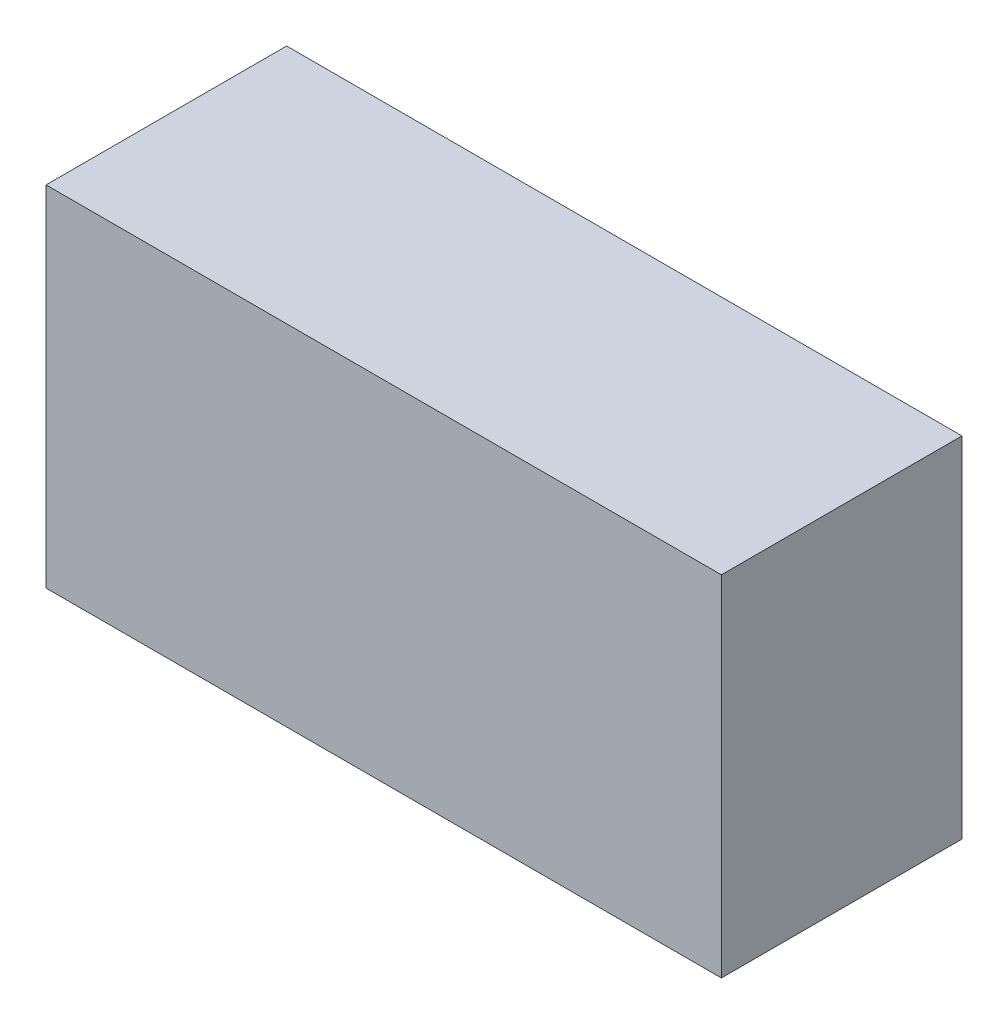
ISO-10303-21;
HEADER;
FILE_DESCRIPTION(('STEP AP214'),'2;1');
FILE_NAME('part.step','',(''),(''),'','','');
FILE_SCHEMA(('AUTOMOTIVE_DESIGN { 1 0 10303 214 1 1 1 1 }'));
ENDSEC;
DATA;
#1=APPLICATION_CONTEXT('core data for automotive mechanical design processes');
#2=APPLICATION_PROTOCOL_DEFINITION('international standard','automotive_design',2000,#1);
#3=PRODUCT_CONTEXT('',#1,'mechanical');
#4=PRODUCT('Part','Part','',(#3));
#5=PRODUCT_RELATED_PRODUCT_CATEGORY('part','',(#4));
#6=PRODUCT_DEFINITION_FORMATION('','',#4);
#7=PRODUCT_DEFINITION_CONTEXT('part definition',#1,'design');
#8=PRODUCT_DEFINITION('design','',#6,#7);
#9=PRODUCT_DEFINITION_SHAPE('','',#8);
#10=(LENGTH_UNIT() NAMED_UNIT(*) SI_UNIT(.MILLI.,.METRE.));
#11=(NAMED_UNIT(*) PLANE_ANGLE_UNIT() SI_UNIT($,.RADIAN.));
#12=(NAMED_UNIT(*) SI_UNIT($,.STERADIAN.) SOLID_ANGLE_UNIT());
#13=UNCERTAINTY_MEASURE_WITH_UNIT(LENGTH_MEASURE(1.E-05),#10,'distance_accuracy_value','');
#14=(GEOMETRIC_REPRESENTATION_CONTEXT(3) GLOBAL_UNCERTAINTY_ASSIGNED_CONTEXT((#13)) GLOBAL_UNIT_ASSIGNED_CONTEXT((#10,
#11,#12)) REPRESENTATION_CONTEXT('',''));
#15=CARTESIAN_POINT('',(0.,0.,0.));
#16=DIRECTION('',(0.,0.,1.));
#17=DIRECTION('',(1.,0.,0.));
#18=AXIS2_PLACEMENT_3D('',#15,#16,#17);
#19=CARTESIAN_POINT('',(9.825,10.16,-3.5));
#20=DIRECTION('',(-1.,0.,0.));
#21=DIRECTION('',(0.,0.,1.));
#22=AXIS2_PLACEMENT_3D('',#19,#20,#21);
#23=PLANE('',#22);
#24=DIRECTION('',(0.,0.,-1.));
#25=VECTOR('',#24,1.);
#26=CARTESIAN_POINT('',(9.825,0.,-3.5));
#27=LINE('',#26,#25);
#28=CARTESIAN_POINT('',(9.825,0.,3.5));
#29=VERTEX_POINT('',#28);
#30=CARTESIAN_POINT('',(9.825,0.,-3.5));
#31=VERTEX_POINT('',#30);
#32=EDGE_CURVE('E104',#29,#31,#27,.T.);
#33=ORIENTED_EDGE('',*,*,#32,.T.);
#34=DIRECTION('',(0.,-1.,0.));
#35=VECTOR('',#34,1.);
#36=CARTESIAN_POINT('',(9.825,10.16,-3.5));
#37=LINE('',#36,#35);
#38=CARTESIAN_POINT('',(9.825,10.16,-3.5));
#39=VERTEX_POINT('',#38);
#40=EDGE_CURVE('E95',#39,#31,#37,.T.);
#41=ORIENTED_EDGE('',*,*,#40,.F.);
#42=DIRECTION('',(0.,0.,-1.));
#43=VECTOR('',#42,1.);
#44=CARTESIAN_POINT('',(9.825,10.16,-3.5));
#45=LINE('',#44,#43);
#46=CARTESIAN_POINT('',(9.825,10.16,3.5));
#47=VERTEX_POINT('',#46);
#48=EDGE_CURVE('E89',#47,#39,#45,.T.);
#49=ORIENTED_EDGE('',*,*,#48,.F.);
#50=DIRECTION('',(0.,-1.,0.));
#51=VECTOR('',#50,1.);
#52=CARTESIAN_POINT('',(9.825,10.16,3.5));
#53=LINE('',#52,#51);
#54=EDGE_CURVE('E100',#47,#29,#53,.T.);
#55=ORIENTED_EDGE('',*,*,#54,.T.);
#56=EDGE_LOOP('',(#33,#41,#49,#55));
#57=FACE_BOUND('',#56,.T.);
#58=ADVANCED_FACE('F37',(#57),#23,.F.);
#59=CARTESIAN_POINT('',(-9.825,10.16,-3.5));
#60=DIRECTION('',(0.,0.,1.));
#61=DIRECTION('',(1.,0.,0.));
#62=AXIS2_PLACEMENT_3D('',#59,#60,#61);
#63=PLANE('',#62);
#64=DIRECTION('',(-1.,0.,0.));
#65=VECTOR('',#64,1.);
#66=CARTESIAN_POINT('',(-9.825,0.,-3.5));
#67=LINE('',#66,#65);
#68=CARTESIAN_POINT('',(-9.825,0.,-3.5));
#69=VERTEX_POINT('',#68);
#70=EDGE_CURVE('E94',#31,#69,#67,.T.);
#71=ORIENTED_EDGE('',*,*,#70,.T.);
#72=DIRECTION('',(0.,-1.,0.));
#73=VECTOR('',#72,1.);
#74=CARTESIAN_POINT('',(-9.825,10.16,-3.5));
#75=LINE('',#74,#73);
#76=CARTESIAN_POINT('',(-9.825,10.16,-3.5));
#77=VERTEX_POINT('',#76);
#78=EDGE_CURVE('E92',#77,#69,#75,.T.);
#79=ORIENTED_EDGE('',*,*,#78,.F.);
#80=DIRECTION('',(-1.,0.,0.));
#81=VECTOR('',#80,1.);
#82=CARTESIAN_POINT('',(-9.825,10.16,-3.5));
#83=LINE('',#82,#81);
#84=EDGE_CURVE('E84',#39,#77,#83,.T.);
#85=ORIENTED_EDGE('',*,*,#84,.F.);
#86=ORIENTED_EDGE('',*,*,#40,.T.);
#87=EDGE_LOOP('',(#71,#79,#85,#86));
#88=FACE_BOUND('',#87,.T.);
#89=ADVANCED_FACE('F93',(#88),#63,.F.);
#90=CARTESIAN_POINT('',(-9.825,10.16,-3.5));
#91=DIRECTION('',(1.,0.,0.));
#92=DIRECTION('',(0.,0.,-1.));
#93=AXIS2_PLACEMENT_3D('',#90,#91,#92);
#94=PLANE('',#93);
#95=DIRECTION('',(0.,0.,1.));
#96=VECTOR('',#95,1.);
#97=CARTESIAN_POINT('',(-9.825,0.,-3.5));
#98=LINE('',#97,#96);
#99=CARTESIAN_POINT('',(-9.825,0.,3.5));
#100=VERTEX_POINT('',#99);
#101=EDGE_CURVE('E70',#69,#100,#98,.T.);
#102=ORIENTED_EDGE('',*,*,#101,.T.);
#103=DIRECTION('',(0.,-1.,0.));
#104=VECTOR('',#103,1.);
#105=CARTESIAN_POINT('',(-9.825,10.16,3.5));
#106=LINE('',#105,#104);
#107=CARTESIAN_POINT('',(-9.825,10.16,3.5));
#108=VERTEX_POINT('',#107);
#109=EDGE_CURVE('E96',#108,#100,#106,.T.);
#110=ORIENTED_EDGE('',*,*,#109,.F.);
#111=DIRECTION('',(0.,0.,1.));
#112=VECTOR('',#111,1.);
#113=CARTESIAN_POINT('',(-9.825,10.16,-3.5));
#114=LINE('',#113,#112);
#115=EDGE_CURVE('E87',#77,#108,#114,.T.);
#116=ORIENTED_EDGE('',*,*,#115,.F.);
#117=ORIENTED_EDGE('',*,*,#78,.T.);
#118=EDGE_LOOP('',(#102,#110,#116,#117));
#119=FACE_BOUND('',#118,.T.);
#120=ADVANCED_FACE('F98',(#119),#94,.F.);
#121=CARTESIAN_POINT('',(-9.825,10.16,3.5));
#122=DIRECTION('',(0.,0.,-1.));
#123=DIRECTION('',(-1.,0.,0.));
#124=AXIS2_PLACEMENT_3D('',#121,#122,#123);
#125=PLANE('',#124);
#126=DIRECTION('',(1.,0.,0.));
#127=VECTOR('',#126,1.);
#128=CARTESIAN_POINT('',(-9.825,0.,3.5));
#129=LINE('',#128,#127);
#130=EDGE_CURVE('E76',#100,#29,#129,.T.);
#131=ORIENTED_EDGE('',*,*,#130,.T.);
#132=ORIENTED_EDGE('',*,*,#54,.F.);
#133=DIRECTION('',(1.,0.,0.));
#134=VECTOR('',#133,1.);
#135=CARTESIAN_POINT('',(-9.825,10.16,3.5));
#136=LINE('',#135,#134);
#137=EDGE_CURVE('E53',#108,#47,#136,.T.);
#138=ORIENTED_EDGE('',*,*,#137,.F.);
#139=ORIENTED_EDGE('',*,*,#109,.T.);
#140=EDGE_LOOP('',(#131,#132,#138,#139));
#141=FACE_BOUND('',#140,.T.);
#142=ADVANCED_FACE('F141',(#141),#125,.F.);
#143=CARTESIAN_POINT('',(0.,10.16,0.));
#144=DIRECTION('',(0.,1.,0.));
#145=DIRECTION('',(0.,0.,1.));
#146=AXIS2_PLACEMENT_3D('',#143,#144,#145);
#147=PLANE('',#146);
#148=ORIENTED_EDGE('',*,*,#48,.T.);
#149=ORIENTED_EDGE('',*,*,#84,.T.);
#150=ORIENTED_EDGE('',*,*,#115,.T.);
#151=ORIENTED_EDGE('',*,*,#137,.T.);
#152=EDGE_LOOP('',(#148,#149,#150,#151));
#153=FACE_BOUND('',#152,.T.);
#154=ADVANCED_FACE('F85',(#153),#147,.T.);
#155=CARTESIAN_POINT('',(0.,0.,0.));
#156=DIRECTION('',(0.,1.,0.));
#157=DIRECTION('',(0.,0.,1.));
#158=AXIS2_PLACEMENT_3D('',#155,#156,#157);
#159=PLANE('',#158);
#160=CARTESIAN_POINT('',(-7.615,0.,-2.8));
#161=DIRECTION('',(0.,1.,0.));
#162=DIRECTION('',(0.,0.,1.));
#163=AXIS2_PLACEMENT_3D('',#160,#161,#162);
#164=CIRCLE('',#163,0.249999999999999);
#165=CARTESIAN_POINT('',(-7.615,0.,-2.55));
#166=VERTEX_POINT('',#165);
#167=EDGE_CURVE('E11',#166,#166,#164,.F.);
#168=ORIENTED_EDGE('',*,*,#167,.F.);
#169=EDGE_LOOP('',(#168));
#170=FACE_BOUND('',#169,.T.);
#171=CARTESIAN_POINT('',(-5.075,0.,-2.8));
#172=DIRECTION('',(0.,1.,0.));
#173=DIRECTION('',(0.,0.,1.));
#174=AXIS2_PLACEMENT_3D('',#171,#172,#173);
#175=CIRCLE('',#174,0.25);
#176=CARTESIAN_POINT('',(-5.075,0.,-2.55));
#177=VERTEX_POINT('',#176);
#178=EDGE_CURVE('E45',#177,#177,#175,.F.);
#179=ORIENTED_EDGE('',*,*,#178,.F.);
#180=EDGE_LOOP('',(#179));
#181=FACE_BOUND('',#180,.T.);
#182=CARTESIAN_POINT('',(5.085,0.,-2.8));
#183=DIRECTION('',(0.,1.,0.));
#184=DIRECTION('',(0.,0.,1.));
#185=AXIS2_PLACEMENT_3D('',#182,#183,#184);
#186=CIRCLE('',#185,0.25);
#187=CARTESIAN_POINT('',(5.085,0.,-2.55));
#188=VERTEX_POINT('',#187);
#189=EDGE_CURVE('E120',#188,#188,#186,.F.);
#190=ORIENTED_EDGE('',*,*,#189,.F.);
#191=EDGE_LOOP('',(#190));
#192=FACE_BOUND('',#191,.T.);
#193=CARTESIAN_POINT('',(2.545,0.,-2.8));
#194=DIRECTION('',(0.,1.,0.));
#195=DIRECTION('',(0.,0.,1.));
#196=AXIS2_PLACEMENT_3D('',#193,#194,#195);
#197=CIRCLE('',#196,0.250000000000001);
#198=CARTESIAN_POINT('',(2.545,0.,-2.55));
#199=VERTEX_POINT('',#198);
#200=EDGE_CURVE('E117',#199,#199,#197,.F.);
#201=ORIENTED_EDGE('',*,*,#200,.F.);
#202=EDGE_LOOP('',(#201));
#203=FACE_BOUND('',#202,.T.);
#204=CARTESIAN_POINT('',(0.005,0.,-2.8));
#205=DIRECTION('',(0.,1.,0.));
#206=DIRECTION('',(0.,0.,1.));
#207=AXIS2_PLACEMENT_3D('',#204,#205,#206);
#208=CIRCLE('',#207,0.25);
#209=CARTESIAN_POINT('',(0.005,0.,-2.55));
#210=VERTEX_POINT('',#209);
#211=EDGE_CURVE('E114',#210,#210,#208,.F.);
#212=ORIENTED_EDGE('',*,*,#211,.F.);
#213=EDGE_LOOP('',(#212));
#214=FACE_BOUND('',#213,.T.);
#215=ORIENTED_EDGE('',*,*,#32,.F.);
#216=ORIENTED_EDGE('',*,*,#130,.F.);
#217=ORIENTED_EDGE('',*,*,#101,.F.);
#218=ORIENTED_EDGE('',*,*,#70,.F.);
#219=EDGE_LOOP('',(#215,#216,#217,#218));
#220=FACE_BOUND('',#219,.T.);
#221=ADVANCED_FACE('F127',(#170,#181,#192,#203,#214,#220),#159,.F.);
#222=CARTESIAN_POINT('',(0.005,-4.1,-2.8));
#223=DIRECTION('',(0.,1.,0.));
#224=DIRECTION('',(0.,0.,1.));
#225=AXIS2_PLACEMENT_3D('',#222,#223,#224);
#226=CYLINDRICAL_SURFACE('',#225,0.25);
#227=CARTESIAN_POINT('',(0.005,-4.1,-2.8));
#228=DIRECTION('',(0.,-1.,0.));
#229=DIRECTION('',(0.,0.,-1.));
#230=AXIS2_PLACEMENT_3D('',#227,#228,#229);
#231=CIRCLE('',#230,0.25);
#232=CARTESIAN_POINT('',(0.005,-4.1,-3.05));
#233=VERTEX_POINT('',#232);
#234=EDGE_CURVE('E107',#233,#233,#231,.T.);
#235=ORIENTED_EDGE('',*,*,#234,.F.);
#236=EDGE_LOOP('',(#235));
#237=FACE_BOUND('',#236,.T.);
#238=ORIENTED_EDGE('',*,*,#211,.T.);
#239=EDGE_LOOP('',(#238));
#240=FACE_BOUND('',#239,.T.);
#241=ADVANCED_FACE('F130',(#237,#240),#226,.T.);
#242=CARTESIAN_POINT('',(0.005,-4.1,-2.8));
#243=DIRECTION('',(0.,-1.,0.));
#244=DIRECTION('',(0.,0.,-1.));
#245=AXIS2_PLACEMENT_3D('',#242,#243,#244);
#246=PLANE('',#245);
#247=ORIENTED_EDGE('',*,*,#234,.T.);
#248=EDGE_LOOP('',(#247));
#249=FACE_BOUND('',#248,.T.);
#250=ADVANCED_FACE('F189',(#249),#246,.T.);
#251=CARTESIAN_POINT('',(2.545,-4.1,-2.8));
#252=DIRECTION('',(0.,1.,0.));
#253=DIRECTION('',(0.,0.,1.));
#254=AXIS2_PLACEMENT_3D('',#251,#252,#253);
#255=CYLINDRICAL_SURFACE('',#254,0.250000000000001);
#256=CARTESIAN_POINT('',(2.545,-4.1,-2.8));
#257=DIRECTION('',(0.,-1.,0.));
#258=DIRECTION('',(0.,0.,-1.));
#259=AXIS2_PLACEMENT_3D('',#256,#257,#258);
#260=CIRCLE('',#259,0.250000000000001);
#261=CARTESIAN_POINT('',(2.545,-4.1,-3.05));
#262=VERTEX_POINT('',#261);
#263=EDGE_CURVE('E327',#262,#262,#260,.T.);
#264=ORIENTED_EDGE('',*,*,#263,.F.);
#265=EDGE_LOOP('',(#264));
#266=FACE_BOUND('',#265,.T.);
#267=ORIENTED_EDGE('',*,*,#200,.T.);
#268=EDGE_LOOP('',(#267));
#269=FACE_BOUND('',#268,.T.);
#270=ADVANCED_FACE('F200',(#266,#269),#255,.T.);
#271=CARTESIAN_POINT('',(2.545,-4.1,-2.8));
#272=DIRECTION('',(0.,-1.,0.));
#273=DIRECTION('',(0.,0.,-1.));
#274=AXIS2_PLACEMENT_3D('',#271,#272,#273);
#275=PLANE('',#274);
#276=ORIENTED_EDGE('',*,*,#263,.T.);
#277=EDGE_LOOP('',(#276));
#278=FACE_BOUND('',#277,.T.);
#279=ADVANCED_FACE('F211',(#278),#275,.T.);
#280=CARTESIAN_POINT('',(5.085,-4.1,-2.8));
#281=DIRECTION('',(0.,1.,0.));
#282=DIRECTION('',(0.,0.,1.));
#283=AXIS2_PLACEMENT_3D('',#280,#281,#282);
#284=CYLINDRICAL_SURFACE('',#283,0.25);
#285=CARTESIAN_POINT('',(5.085,-4.1,-2.8));
#286=DIRECTION('',(0.,-1.,0.));
#287=DIRECTION('',(0.,0.,-1.));
#288=AXIS2_PLACEMENT_3D('',#285,#286,#287);
#289=CIRCLE('',#288,0.25);
#290=CARTESIAN_POINT('',(5.085,-4.1,-3.05));
#291=VERTEX_POINT('',#290);
#292=EDGE_CURVE('E322',#291,#291,#289,.T.);
#293=ORIENTED_EDGE('',*,*,#292,.F.);
#294=EDGE_LOOP('',(#293));
#295=FACE_BOUND('',#294,.T.);
#296=ORIENTED_EDGE('',*,*,#189,.T.);
#297=EDGE_LOOP('',(#296));
#298=FACE_BOUND('',#297,.T.);
#299=ADVANCED_FACE('F222',(#295,#298),#284,.T.);
#300=CARTESIAN_POINT('',(5.085,-4.1,-2.8));
#301=DIRECTION('',(0.,-1.,0.));
#302=DIRECTION('',(0.,0.,-1.));
#303=AXIS2_PLACEMENT_3D('',#300,#301,#302);
#304=PLANE('',#303);
#305=ORIENTED_EDGE('',*,*,#292,.T.);
#306=EDGE_LOOP('',(#305));
#307=FACE_BOUND('',#306,.T.);
#308=ADVANCED_FACE('F233',(#307),#304,.T.);
#309=CARTESIAN_POINT('',(-5.075,-4.1,-2.8));
#310=DIRECTION('',(0.,1.,0.));
#311=DIRECTION('',(0.,0.,1.));
#312=AXIS2_PLACEMENT_3D('',#309,#310,#311);
#313=CYLINDRICAL_SURFACE('',#312,0.25);
#314=CARTESIAN_POINT('',(-5.075,-4.1,-2.8));
#315=DIRECTION('',(0.,-1.,0.));
#316=DIRECTION('',(0.,0.,-1.));
#317=AXIS2_PLACEMENT_3D('',#314,#315,#316);
#318=CIRCLE('',#317,0.25);
#319=CARTESIAN_POINT('',(-5.075,-4.1,-3.05));
#320=VERTEX_POINT('',#319);
#321=EDGE_CURVE('E319',#320,#320,#318,.T.);
#322=ORIENTED_EDGE('',*,*,#321,.F.);
#323=EDGE_LOOP('',(#322));
#324=FACE_BOUND('',#323,.T.);
#325=ORIENTED_EDGE('',*,*,#178,.T.);
#326=EDGE_LOOP('',(#325));
#327=FACE_BOUND('',#326,.T.);
#328=ADVANCED_FACE('F125',(#324,#327),#313,.T.);
#329=CARTESIAN_POINT('',(-5.075,-4.1,-2.8));
#330=DIRECTION('',(0.,-1.,0.));
#331=DIRECTION('',(0.,0.,-1.));
#332=AXIS2_PLACEMENT_3D('',#329,#330,#331);
#333=PLANE('',#332);
#334=ORIENTED_EDGE('',*,*,#321,.T.);
#335=EDGE_LOOP('',(#334));
#336=FACE_BOUND('',#335,.T.);
#337=ADVANCED_FACE('F254',(#336),#333,.T.);
#338=CARTESIAN_POINT('',(-7.615,-4.1,-2.8));
#339=DIRECTION('',(0.,1.,0.));
#340=DIRECTION('',(0.,0.,1.));
#341=AXIS2_PLACEMENT_3D('',#338,#339,#340);
#342=CYLINDRICAL_SURFACE('',#341,0.249999999999999);
#343=CARTESIAN_POINT('',(-7.615,-4.1,-2.8));
#344=DIRECTION('',(0.,-1.,0.));
#345=DIRECTION('',(0.,0.,-1.));
#346=AXIS2_PLACEMENT_3D('',#343,#344,#345);
#347=CIRCLE('',#346,0.249999999999999);
#348=CARTESIAN_POINT('',(-7.615,-4.1,-3.05));
#349=VERTEX_POINT('',#348);
#350=EDGE_CURVE('E318',#349,#349,#347,.T.);
#351=ORIENTED_EDGE('',*,*,#350,.F.);
#352=EDGE_LOOP('',(#351));
#353=FACE_BOUND('',#352,.T.);
#354=ORIENTED_EDGE('',*,*,#167,.T.);
#355=EDGE_LOOP('',(#354));
#356=FACE_BOUND('',#355,.T.);
#357=ADVANCED_FACE('F265',(#353,#356),#342,.T.);
#358=CARTESIAN_POINT('',(-7.615,-4.1,-2.8));
#359=DIRECTION('',(0.,-1.,0.));
#360=DIRECTION('',(0.,0.,-1.));
#361=AXIS2_PLACEMENT_3D('',#358,#359,#360);
#362=PLANE('',#361);
#363=ORIENTED_EDGE('',*,*,#350,.T.);
#364=EDGE_LOOP('',(#363));
#365=FACE_BOUND('',#364,.T.);
#366=ADVANCED_FACE('F276',(#365),#362,.T.);
#367=CLOSED_SHELL('',(#58,#89,#120,#142,#154,#221,#241,#250,#270,#279,#299,#308,#328,#337,#357,#366));
#368=MANIFOLD_SOLID_BREP('B2',#367);
#369=ADVANCED_BREP_SHAPE_REPRESENTATION('',(#18,#368),#14);
#370=SHAPE_DEFINITION_REPRESENTATION(#9,#369);
ENDSEC;
END-ISO-10303-21;
